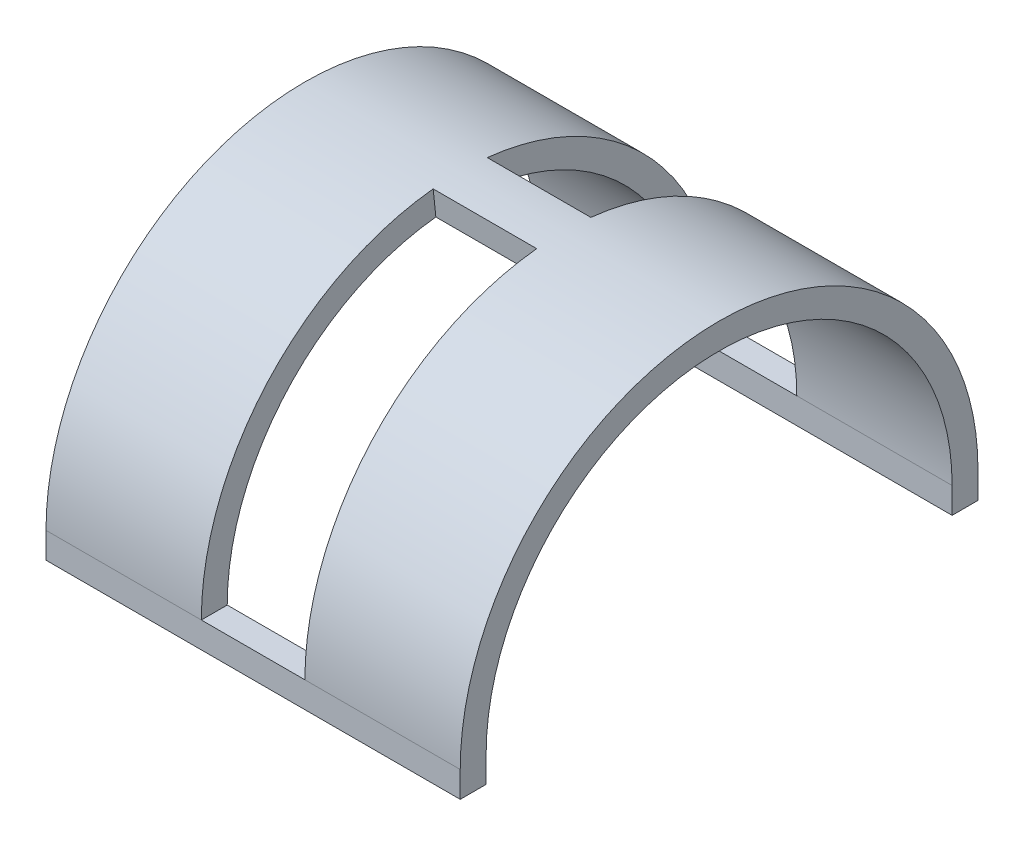
ISO-10303-21;
HEADER;
FILE_DESCRIPTION(('STEP AP214'),'2;1');
FILE_NAME('part.step','',(''),(''),'','','');
FILE_SCHEMA(('AUTOMOTIVE_DESIGN { 1 0 10303 214 1 1 1 1 }'));
ENDSEC;
DATA;
#1=APPLICATION_CONTEXT('core data for automotive mechanical design processes');
#2=APPLICATION_PROTOCOL_DEFINITION('international standard','automotive_design',2000,#1);
#3=PRODUCT_CONTEXT('',#1,'mechanical');
#4=PRODUCT('Part','Part','',(#3));
#5=PRODUCT_RELATED_PRODUCT_CATEGORY('part','',(#4));
#6=PRODUCT_DEFINITION_FORMATION('','',#4);
#7=PRODUCT_DEFINITION_CONTEXT('part definition',#1,'design');
#8=PRODUCT_DEFINITION('design','',#6,#7);
#9=PRODUCT_DEFINITION_SHAPE('','',#8);
#10=(LENGTH_UNIT() NAMED_UNIT(*) SI_UNIT(.MILLI.,.METRE.));
#11=(NAMED_UNIT(*) PLANE_ANGLE_UNIT() SI_UNIT($,.RADIAN.));
#12=(NAMED_UNIT(*) SI_UNIT($,.STERADIAN.) SOLID_ANGLE_UNIT());
#13=UNCERTAINTY_MEASURE_WITH_UNIT(LENGTH_MEASURE(1.E-05),#10,'distance_accuracy_value','');
#14=(GEOMETRIC_REPRESENTATION_CONTEXT(3) GLOBAL_UNCERTAINTY_ASSIGNED_CONTEXT((#13)) GLOBAL_UNIT_ASSIGNED_CONTEXT((#10,
#11,#12)) REPRESENTATION_CONTEXT('',''));
#15=CARTESIAN_POINT('',(0.,0.,0.));
#16=DIRECTION('',(0.,0.,1.));
#17=DIRECTION('',(1.,0.,0.));
#18=AXIS2_PLACEMENT_3D('',#15,#16,#17);
#19=CARTESIAN_POINT('',(30.,0.,0.));
#20=DIRECTION('',(-1.,0.,0.));
#21=DIRECTION('',(0.,0.,1.));
#22=AXIS2_PLACEMENT_3D('',#19,#20,#21);
#23=PLANE('',#22);
#24=DIRECTION('',(0.,0.994521895368274,-0.104528463267646));
#25=VECTOR('',#24,1.);
#26=CARTESIAN_POINT('',(30.,0.,0.));
#27=LINE('',#26,#25);
#28=CARTESIAN_POINT('',(30.,44.7534852915723,-4.70378084704408));
#29=VERTEX_POINT('',#28);
#30=CARTESIAN_POINT('',(30.,49.7260947684137,-5.22642316338232));
#31=VERTEX_POINT('',#30);
#32=EDGE_CURVE('E52',#29,#31,#27,.T.);
#33=ORIENTED_EDGE('',*,*,#32,.F.);
#34=CARTESIAN_POINT('',(30.,0.,0.));
#35=DIRECTION('',(-1.,0.,0.));
#36=DIRECTION('',(0.,0.,1.));
#37=AXIS2_PLACEMENT_3D('',#34,#35,#36);
#38=CIRCLE('',#37,45.);
#39=CARTESIAN_POINT('',(30.,0.,-45.));
#40=VERTEX_POINT('',#39);
#41=EDGE_CURVE('E259',#29,#40,#38,.T.);
#42=ORIENTED_EDGE('',*,*,#41,.T.);
#43=DIRECTION('',(0.,0.,-1.));
#44=VECTOR('',#43,1.);
#45=CARTESIAN_POINT('',(30.,0.,-45.));
#46=LINE('',#45,#44);
#47=CARTESIAN_POINT('',(30.,0.,-50.));
#48=VERTEX_POINT('',#47);
#49=EDGE_CURVE('E261',#40,#48,#46,.T.);
#50=ORIENTED_EDGE('',*,*,#49,.T.);
#51=CARTESIAN_POINT('',(30.,0.,0.));
#52=DIRECTION('',(1.,0.,0.));
#53=DIRECTION('',(0.,0.,1.));
#54=AXIS2_PLACEMENT_3D('',#51,#52,#53);
#55=CIRCLE('',#54,50.);
#56=EDGE_CURVE('E254',#48,#31,#55,.T.);
#57=ORIENTED_EDGE('',*,*,#56,.T.);
#58=EDGE_LOOP('',(#33,#42,#50,#57));
#59=FACE_BOUND('',#58,.T.);
#60=ADVANCED_FACE('F37',(#59),#23,.F.);
#61=CARTESIAN_POINT('',(30.,0.,0.));
#62=DIRECTION('',(-1.,0.,0.));
#63=DIRECTION('',(0.,0.,1.));
#64=AXIS2_PLACEMENT_3D('',#61,#62,#63);
#65=CYLINDRICAL_SURFACE('',#64,50.);
#66=CARTESIAN_POINT('',(0.,0.,0.));
#67=DIRECTION('',(1.,0.,0.));
#68=DIRECTION('',(0.,0.,1.));
#69=AXIS2_PLACEMENT_3D('',#66,#67,#68);
#70=CIRCLE('',#69,50.);
#71=CARTESIAN_POINT('',(0.,0.,-50.));
#72=VERTEX_POINT('',#71);
#73=CARTESIAN_POINT('',(0.,0.,50.));
#74=VERTEX_POINT('',#73);
#75=EDGE_CURVE('E253',#72,#74,#70,.T.);
#76=ORIENTED_EDGE('',*,*,#75,.T.);
#77=DIRECTION('',(-1.,0.,0.));
#78=VECTOR('',#77,1.);
#79=CARTESIAN_POINT('',(30.,0.,50.));
#80=LINE('',#79,#78);
#81=CARTESIAN_POINT('',(30.,0.,50.));
#82=VERTEX_POINT('',#81);
#83=EDGE_CURVE('E11',#82,#74,#80,.T.);
#84=ORIENTED_EDGE('',*,*,#83,.F.);
#85=CARTESIAN_POINT('',(30.,49.7260947684137,5.22642316338234));
#86=VERTEX_POINT('',#85);
#87=EDGE_CURVE('E257',#86,#82,#55,.T.);
#88=ORIENTED_EDGE('',*,*,#87,.F.);
#89=DIRECTION('',(-1.,0.,0.));
#90=VECTOR('',#89,1.);
#91=CARTESIAN_POINT('',(40.,49.7260947684137,5.22642316338234));
#92=LINE('',#91,#90);
#93=CARTESIAN_POINT('',(50.,49.7260947684137,5.22642316338234));
#94=VERTEX_POINT('',#93);
#95=EDGE_CURVE('E244',#94,#86,#92,.T.);
#96=ORIENTED_EDGE('',*,*,#95,.F.);
#97=CARTESIAN_POINT('',(50.,0.,0.));
#98=DIRECTION('',(1.,0.,0.));
#99=DIRECTION('',(0.,0.,1.));
#100=AXIS2_PLACEMENT_3D('',#97,#98,#99);
#101=CIRCLE('',#100,50.);
#102=CARTESIAN_POINT('',(50.,0.,50.));
#103=VERTEX_POINT('',#102);
#104=EDGE_CURVE('E218',#94,#103,#101,.T.);
#105=ORIENTED_EDGE('',*,*,#104,.T.);
#106=DIRECTION('',(1.,0.,0.));
#107=VECTOR('',#106,1.);
#108=CARTESIAN_POINT('',(50.,0.,50.));
#109=LINE('',#108,#107);
#110=CARTESIAN_POINT('',(80.,0.,50.));
#111=VERTEX_POINT('',#110);
#112=EDGE_CURVE('E236',#103,#111,#109,.T.);
#113=ORIENTED_EDGE('',*,*,#112,.T.);
#114=CARTESIAN_POINT('',(80.,0.,0.));
#115=DIRECTION('',(1.,0.,0.));
#116=DIRECTION('',(0.,0.,1.));
#117=AXIS2_PLACEMENT_3D('',#114,#115,#116);
#118=CIRCLE('',#117,50.);
#119=CARTESIAN_POINT('',(80.,0.,-50.));
#120=VERTEX_POINT('',#119);
#121=EDGE_CURVE('E213',#120,#111,#118,.T.);
#122=ORIENTED_EDGE('',*,*,#121,.F.);
#123=DIRECTION('',(1.,0.,0.));
#124=VECTOR('',#123,1.);
#125=CARTESIAN_POINT('',(50.,0.,-50.));
#126=LINE('',#125,#124);
#127=CARTESIAN_POINT('',(50.,0.,-50.));
#128=VERTEX_POINT('',#127);
#129=EDGE_CURVE('E226',#128,#120,#126,.T.);
#130=ORIENTED_EDGE('',*,*,#129,.F.);
#131=CARTESIAN_POINT('',(50.,49.7260947684137,-5.22642316338232));
#132=VERTEX_POINT('',#131);
#133=EDGE_CURVE('E214',#128,#132,#101,.T.);
#134=ORIENTED_EDGE('',*,*,#133,.T.);
#135=DIRECTION('',(-1.,0.,0.));
#136=VECTOR('',#135,1.);
#137=CARTESIAN_POINT('',(40.,49.7260947684137,-5.22642316338232));
#138=LINE('',#137,#136);
#139=EDGE_CURVE('E247',#132,#31,#138,.T.);
#140=ORIENTED_EDGE('',*,*,#139,.T.);
#141=ORIENTED_EDGE('',*,*,#56,.F.);
#142=DIRECTION('',(-1.,0.,0.));
#143=VECTOR('',#142,1.);
#144=CARTESIAN_POINT('',(30.,0.,-50.));
#145=LINE('',#144,#143);
#146=EDGE_CURVE('E263',#48,#72,#145,.T.);
#147=ORIENTED_EDGE('',*,*,#146,.T.);
#148=EDGE_LOOP('',(#76,#84,#88,#96,#105,#113,#122,#130,#134,#140,#141,#147));
#149=FACE_BOUND('',#148,.T.);
#150=ADVANCED_FACE('F39',(#149),#65,.T.);
#151=CARTESIAN_POINT('',(30.,0.,0.));
#152=DIRECTION('',(-1.,0.,0.));
#153=DIRECTION('',(0.,0.,1.));
#154=AXIS2_PLACEMENT_3D('',#151,#152,#153);
#155=CYLINDRICAL_SURFACE('',#154,45.);
#156=CARTESIAN_POINT('',(0.,0.,0.));
#157=DIRECTION('',(-1.,0.,0.));
#158=DIRECTION('',(0.,0.,1.));
#159=AXIS2_PLACEMENT_3D('',#156,#157,#158);
#160=CIRCLE('',#159,45.);
#161=CARTESIAN_POINT('',(0.,0.,45.));
#162=VERTEX_POINT('',#161);
#163=CARTESIAN_POINT('',(0.,0.,-45.));
#164=VERTEX_POINT('',#163);
#165=EDGE_CURVE('E265',#162,#164,#160,.T.);
#166=ORIENTED_EDGE('',*,*,#165,.T.);
#167=DIRECTION('',(-1.,0.,0.));
#168=VECTOR('',#167,1.);
#169=CARTESIAN_POINT('',(30.,0.,-45.));
#170=LINE('',#169,#168);
#171=EDGE_CURVE('E269',#40,#164,#170,.T.);
#172=ORIENTED_EDGE('',*,*,#171,.F.);
#173=ORIENTED_EDGE('',*,*,#41,.F.);
#174=DIRECTION('',(-1.,0.,0.));
#175=VECTOR('',#174,1.);
#176=CARTESIAN_POINT('',(40.,44.7534852915723,-4.70378084704408));
#177=LINE('',#176,#175);
#178=CARTESIAN_POINT('',(50.,44.7534852915723,-4.70378084704408));
#179=VERTEX_POINT('',#178);
#180=EDGE_CURVE('E250',#179,#29,#177,.T.);
#181=ORIENTED_EDGE('',*,*,#180,.F.);
#182=CARTESIAN_POINT('',(50.,0.,0.));
#183=DIRECTION('',(-1.,0.,0.));
#184=DIRECTION('',(0.,0.,1.));
#185=AXIS2_PLACEMENT_3D('',#182,#183,#184);
#186=CIRCLE('',#185,45.);
#187=CARTESIAN_POINT('',(50.,0.,-45.));
#188=VERTEX_POINT('',#187);
#189=EDGE_CURVE('E220',#179,#188,#186,.T.);
#190=ORIENTED_EDGE('',*,*,#189,.T.);
#191=DIRECTION('',(1.,0.,0.));
#192=VECTOR('',#191,1.);
#193=CARTESIAN_POINT('',(50.,0.,-45.));
#194=LINE('',#193,#192);
#195=CARTESIAN_POINT('',(80.,0.,-45.));
#196=VERTEX_POINT('',#195);
#197=EDGE_CURVE('E231',#188,#196,#194,.T.);
#198=ORIENTED_EDGE('',*,*,#197,.T.);
#199=CARTESIAN_POINT('',(80.,0.,0.));
#200=DIRECTION('',(-1.,0.,0.));
#201=DIRECTION('',(0.,0.,1.));
#202=AXIS2_PLACEMENT_3D('',#199,#200,#201);
#203=CIRCLE('',#202,45.);
#204=CARTESIAN_POINT('',(80.,0.,45.));
#205=VERTEX_POINT('',#204);
#206=EDGE_CURVE('E176',#205,#196,#203,.T.);
#207=ORIENTED_EDGE('',*,*,#206,.F.);
#208=DIRECTION('',(1.,0.,0.));
#209=VECTOR('',#208,1.);
#210=CARTESIAN_POINT('',(50.,0.,45.));
#211=LINE('',#210,#209);
#212=CARTESIAN_POINT('',(50.,0.,45.));
#213=VERTEX_POINT('',#212);
#214=EDGE_CURVE('E233',#213,#205,#211,.T.);
#215=ORIENTED_EDGE('',*,*,#214,.F.);
#216=CARTESIAN_POINT('',(50.,44.7534852915723,4.70378084704411));
#217=VERTEX_POINT('',#216);
#218=EDGE_CURVE('E221',#213,#217,#186,.T.);
#219=ORIENTED_EDGE('',*,*,#218,.T.);
#220=DIRECTION('',(-1.,0.,0.));
#221=VECTOR('',#220,1.);
#222=CARTESIAN_POINT('',(40.,44.7534852915723,4.70378084704411));
#223=LINE('',#222,#221);
#224=CARTESIAN_POINT('',(30.,44.7534852915723,4.70378084704411));
#225=VERTEX_POINT('',#224);
#226=EDGE_CURVE('E242',#217,#225,#223,.T.);
#227=ORIENTED_EDGE('',*,*,#226,.T.);
#228=CARTESIAN_POINT('',(30.,0.,45.));
#229=VERTEX_POINT('',#228);
#230=EDGE_CURVE('E60',#229,#225,#38,.T.);
#231=ORIENTED_EDGE('',*,*,#230,.F.);
#232=DIRECTION('',(-1.,0.,0.));
#233=VECTOR('',#232,1.);
#234=CARTESIAN_POINT('',(30.,0.,45.));
#235=LINE('',#234,#233);
#236=EDGE_CURVE('E45',#229,#162,#235,.T.);
#237=ORIENTED_EDGE('',*,*,#236,.T.);
#238=EDGE_LOOP('',(#166,#172,#173,#181,#190,#198,#207,#215,#219,#227,#231,#237));
#239=FACE_BOUND('',#238,.T.);
#240=ADVANCED_FACE('F273',(#239),#155,.F.);
#241=ORIENTED_EDGE('',*,*,#230,.T.);
#242=DIRECTION('',(0.,0.994521895368274,0.104528463267647));
#243=VECTOR('',#242,1.);
#244=CARTESIAN_POINT('',(30.,0.,0.));
#245=LINE('',#244,#243);
#246=EDGE_CURVE('E240',#225,#86,#245,.T.);
#247=ORIENTED_EDGE('',*,*,#246,.T.);
#248=ORIENTED_EDGE('',*,*,#87,.T.);
#249=DIRECTION('',(0.,0.,-1.));
#250=VECTOR('',#249,1.);
#251=CARTESIAN_POINT('',(30.,0.,50.));
#252=LINE('',#251,#250);
#253=EDGE_CURVE('E256',#82,#229,#252,.T.);
#254=ORIENTED_EDGE('',*,*,#253,.T.);
#255=EDGE_LOOP('',(#241,#247,#248,#254));
#256=FACE_BOUND('',#255,.T.);
#257=ADVANCED_FACE('F344',(#256),#23,.F.);
#258=CARTESIAN_POINT('',(0.,0.,0.));
#259=DIRECTION('',(-1.,0.,0.));
#260=DIRECTION('',(0.,0.,1.));
#261=AXIS2_PLACEMENT_3D('',#258,#259,#260);
#262=PLANE('',#261);
#263=ORIENTED_EDGE('',*,*,#75,.F.);
#264=DIRECTION('',(0.,1.,0.));
#265=VECTOR('',#264,1.);
#266=CARTESIAN_POINT('',(0.,-5.,-50.));
#267=LINE('',#266,#265);
#268=CARTESIAN_POINT('',(0.,-5.,-50.));
#269=VERTEX_POINT('',#268);
#270=EDGE_CURVE('E182',#269,#72,#267,.T.);
#271=ORIENTED_EDGE('',*,*,#270,.F.);
#272=DIRECTION('',(0.,0.,-1.));
#273=VECTOR('',#272,1.);
#274=CARTESIAN_POINT('',(0.,-5.,-50.));
#275=LINE('',#274,#273);
#276=CARTESIAN_POINT('',(0.,-5.,-45.));
#277=VERTEX_POINT('',#276);
#278=EDGE_CURVE('E161',#277,#269,#275,.T.);
#279=ORIENTED_EDGE('',*,*,#278,.F.);
#280=DIRECTION('',(0.,1.,0.));
#281=VECTOR('',#280,1.);
#282=CARTESIAN_POINT('',(0.,-5.,-45.));
#283=LINE('',#282,#281);
#284=EDGE_CURVE('E158',#277,#164,#283,.T.);
#285=ORIENTED_EDGE('',*,*,#284,.T.);
#286=ORIENTED_EDGE('',*,*,#165,.F.);
#287=DIRECTION('',(0.,1.,0.));
#288=VECTOR('',#287,1.);
#289=CARTESIAN_POINT('',(0.,-5.,45.));
#290=LINE('',#289,#288);
#291=CARTESIAN_POINT('',(0.,-5.,45.));
#292=VERTEX_POINT('',#291);
#293=EDGE_CURVE('E204',#292,#162,#290,.T.);
#294=ORIENTED_EDGE('',*,*,#293,.F.);
#295=DIRECTION('',(0.,0.,-1.));
#296=VECTOR('',#295,1.);
#297=CARTESIAN_POINT('',(0.,-5.,50.));
#298=LINE('',#297,#296);
#299=CARTESIAN_POINT('',(0.,-5.,50.));
#300=VERTEX_POINT('',#299);
#301=EDGE_CURVE('E186',#300,#292,#298,.T.);
#302=ORIENTED_EDGE('',*,*,#301,.F.);
#303=DIRECTION('',(0.,1.,0.));
#304=VECTOR('',#303,1.);
#305=CARTESIAN_POINT('',(0.,-5.,50.));
#306=LINE('',#305,#304);
#307=EDGE_CURVE('E194',#300,#74,#306,.T.);
#308=ORIENTED_EDGE('',*,*,#307,.T.);
#309=EDGE_LOOP('',(#263,#271,#279,#285,#286,#294,#302,#308));
#310=FACE_BOUND('',#309,.T.);
#311=ADVANCED_FACE('F282',(#310),#262,.T.);
#312=CARTESIAN_POINT('',(40.,0.,0.));
#313=DIRECTION('',(0.,0.104528463267646,0.994521895368274));
#314=DIRECTION('',(0.,-0.994521895368274,0.104528463267646));
#315=AXIS2_PLACEMENT_3D('',#312,#313,#314);
#316=PLANE('',#315);
#317=ORIENTED_EDGE('',*,*,#32,.T.);
#318=ORIENTED_EDGE('',*,*,#139,.F.);
#319=DIRECTION('',(0.,0.994521895368274,-0.104528463267646));
#320=VECTOR('',#319,1.);
#321=CARTESIAN_POINT('',(50.,0.,0.));
#322=LINE('',#321,#320);
#323=EDGE_CURVE('E207',#179,#132,#322,.T.);
#324=ORIENTED_EDGE('',*,*,#323,.F.);
#325=ORIENTED_EDGE('',*,*,#180,.T.);
#326=EDGE_LOOP('',(#317,#318,#324,#325));
#327=FACE_BOUND('',#326,.T.);
#328=ADVANCED_FACE('F328',(#327),#316,.F.);
#329=CARTESIAN_POINT('',(40.,0.,0.));
#330=DIRECTION('',(0.,-0.104528463267647,0.994521895368274));
#331=DIRECTION('',(0.,-0.994521895368274,-0.104528463267647));
#332=AXIS2_PLACEMENT_3D('',#329,#330,#331);
#333=PLANE('',#332);
#334=ORIENTED_EDGE('',*,*,#246,.F.);
#335=ORIENTED_EDGE('',*,*,#226,.F.);
#336=DIRECTION('',(0.,0.994521895368274,0.104528463267647));
#337=VECTOR('',#336,1.);
#338=CARTESIAN_POINT('',(50.,0.,0.));
#339=LINE('',#338,#337);
#340=EDGE_CURVE('E210',#217,#94,#339,.T.);
#341=ORIENTED_EDGE('',*,*,#340,.T.);
#342=ORIENTED_EDGE('',*,*,#95,.T.);
#343=EDGE_LOOP('',(#334,#335,#341,#342));
#344=FACE_BOUND('',#343,.T.);
#345=ADVANCED_FACE('F332',(#344),#333,.T.);
#346=CARTESIAN_POINT('',(50.,0.,0.));
#347=DIRECTION('',(1.,0.,0.));
#348=DIRECTION('',(0.,0.,1.));
#349=AXIS2_PLACEMENT_3D('',#346,#347,#348);
#350=PLANE('',#349);
#351=ORIENTED_EDGE('',*,*,#323,.T.);
#352=ORIENTED_EDGE('',*,*,#133,.F.);
#353=DIRECTION('',(0.,0.,-1.));
#354=VECTOR('',#353,1.);
#355=CARTESIAN_POINT('',(50.,0.,-45.));
#356=LINE('',#355,#354);
#357=EDGE_CURVE('E224',#188,#128,#356,.T.);
#358=ORIENTED_EDGE('',*,*,#357,.F.);
#359=ORIENTED_EDGE('',*,*,#189,.F.);
#360=EDGE_LOOP('',(#351,#352,#358,#359));
#361=FACE_BOUND('',#360,.T.);
#362=ADVANCED_FACE('F330',(#361),#350,.F.);
#363=ORIENTED_EDGE('',*,*,#218,.F.);
#364=DIRECTION('',(0.,0.,-1.));
#365=VECTOR('',#364,1.);
#366=CARTESIAN_POINT('',(50.,0.,50.));
#367=LINE('',#366,#365);
#368=EDGE_CURVE('E217',#103,#213,#367,.T.);
#369=ORIENTED_EDGE('',*,*,#368,.F.);
#370=ORIENTED_EDGE('',*,*,#104,.F.);
#371=ORIENTED_EDGE('',*,*,#340,.F.);
#372=EDGE_LOOP('',(#363,#369,#370,#371));
#373=FACE_BOUND('',#372,.T.);
#374=ADVANCED_FACE('F312',(#373),#350,.F.);
#375=CARTESIAN_POINT('',(80.,0.,0.));
#376=DIRECTION('',(1.,0.,0.));
#377=DIRECTION('',(0.,0.,1.));
#378=AXIS2_PLACEMENT_3D('',#375,#376,#377);
#379=PLANE('',#378);
#380=ORIENTED_EDGE('',*,*,#121,.T.);
#381=DIRECTION('',(0.,1.,0.));
#382=VECTOR('',#381,1.);
#383=CARTESIAN_POINT('',(80.,-5.,50.));
#384=LINE('',#383,#382);
#385=CARTESIAN_POINT('',(80.,-5.,50.));
#386=VERTEX_POINT('',#385);
#387=EDGE_CURVE('E200',#386,#111,#384,.T.);
#388=ORIENTED_EDGE('',*,*,#387,.F.);
#389=DIRECTION('',(0.,0.,1.));
#390=VECTOR('',#389,1.);
#391=CARTESIAN_POINT('',(80.,-5.,50.));
#392=LINE('',#391,#390);
#393=CARTESIAN_POINT('',(80.,-5.,45.));
#394=VERTEX_POINT('',#393);
#395=EDGE_CURVE('E191',#394,#386,#392,.T.);
#396=ORIENTED_EDGE('',*,*,#395,.F.);
#397=DIRECTION('',(0.,1.,0.));
#398=VECTOR('',#397,1.);
#399=CARTESIAN_POINT('',(80.,-5.,45.));
#400=LINE('',#399,#398);
#401=EDGE_CURVE('E202',#394,#205,#400,.T.);
#402=ORIENTED_EDGE('',*,*,#401,.T.);
#403=ORIENTED_EDGE('',*,*,#206,.T.);
#404=DIRECTION('',(0.,1.,0.));
#405=VECTOR('',#404,1.);
#406=CARTESIAN_POINT('',(80.,-5.,-45.));
#407=LINE('',#406,#405);
#408=CARTESIAN_POINT('',(80.,-5.,-45.));
#409=VERTEX_POINT('',#408);
#410=EDGE_CURVE('E154',#409,#196,#407,.T.);
#411=ORIENTED_EDGE('',*,*,#410,.F.);
#412=DIRECTION('',(0.,0.,1.));
#413=VECTOR('',#412,1.);
#414=CARTESIAN_POINT('',(80.,-5.,-50.));
#415=LINE('',#414,#413);
#416=CARTESIAN_POINT('',(80.,-5.,-50.));
#417=VERTEX_POINT('',#416);
#418=EDGE_CURVE('E162',#417,#409,#415,.T.);
#419=ORIENTED_EDGE('',*,*,#418,.F.);
#420=DIRECTION('',(0.,1.,0.));
#421=VECTOR('',#420,1.);
#422=CARTESIAN_POINT('',(80.,-5.,-50.));
#423=LINE('',#422,#421);
#424=EDGE_CURVE('E286',#417,#120,#423,.T.);
#425=ORIENTED_EDGE('',*,*,#424,.T.);
#426=EDGE_LOOP('',(#380,#388,#396,#402,#403,#411,#419,#425));
#427=FACE_BOUND('',#426,.T.);
#428=ADVANCED_FACE('F174',(#427),#379,.T.);
#429=CARTESIAN_POINT('',(0.,0.,0.));
#430=DIRECTION('',(0.,-1.,0.));
#431=DIRECTION('',(0.,0.,-1.));
#432=AXIS2_PLACEMENT_3D('',#429,#430,#431);
#433=PLANE('',#432);
#434=DIRECTION('',(1.,0.,0.));
#435=VECTOR('',#434,1.);
#436=CARTESIAN_POINT('',(0.,0.,45.));
#437=LINE('',#436,#435);
#438=EDGE_CURVE('E177',#229,#213,#437,.T.);
#439=ORIENTED_EDGE('',*,*,#438,.F.);
#440=ORIENTED_EDGE('',*,*,#253,.F.);
#441=DIRECTION('',(-1.,0.,0.));
#442=VECTOR('',#441,1.);
#443=CARTESIAN_POINT('',(0.,0.,50.));
#444=LINE('',#443,#442);
#445=EDGE_CURVE('E180',#103,#82,#444,.T.);
#446=ORIENTED_EDGE('',*,*,#445,.F.);
#447=ORIENTED_EDGE('',*,*,#368,.T.);
#448=EDGE_LOOP('',(#439,#440,#446,#447));
#449=FACE_BOUND('',#448,.T.);
#450=ADVANCED_FACE('F316',(#449),#433,.F.);
#451=CARTESIAN_POINT('',(0.,-5.,45.));
#452=DIRECTION('',(0.,0.,1.));
#453=DIRECTION('',(1.,0.,0.));
#454=AXIS2_PLACEMENT_3D('',#451,#452,#453);
#455=PLANE('',#454);
#456=ORIENTED_EDGE('',*,*,#236,.F.);
#457=ORIENTED_EDGE('',*,*,#438,.T.);
#458=ORIENTED_EDGE('',*,*,#214,.T.);
#459=ORIENTED_EDGE('',*,*,#401,.F.);
#460=DIRECTION('',(1.,0.,0.));
#461=VECTOR('',#460,1.);
#462=CARTESIAN_POINT('',(0.,-5.,45.));
#463=LINE('',#462,#461);
#464=EDGE_CURVE('E189',#292,#394,#463,.T.);
#465=ORIENTED_EDGE('',*,*,#464,.F.);
#466=ORIENTED_EDGE('',*,*,#293,.T.);
#467=EDGE_LOOP('',(#456,#457,#458,#459,#465,#466));
#468=FACE_BOUND('',#467,.T.);
#469=ADVANCED_FACE('F278',(#468),#455,.F.);
#470=CARTESIAN_POINT('',(0.,-5.,50.));
#471=DIRECTION('',(0.,0.,-1.));
#472=DIRECTION('',(-1.,0.,0.));
#473=AXIS2_PLACEMENT_3D('',#470,#471,#472);
#474=PLANE('',#473);
#475=ORIENTED_EDGE('',*,*,#112,.F.);
#476=ORIENTED_EDGE('',*,*,#445,.T.);
#477=ORIENTED_EDGE('',*,*,#83,.T.);
#478=ORIENTED_EDGE('',*,*,#307,.F.);
#479=DIRECTION('',(-1.,0.,0.));
#480=VECTOR('',#479,1.);
#481=CARTESIAN_POINT('',(0.,-5.,50.));
#482=LINE('',#481,#480);
#483=EDGE_CURVE('E193',#386,#300,#482,.T.);
#484=ORIENTED_EDGE('',*,*,#483,.F.);
#485=ORIENTED_EDGE('',*,*,#387,.T.);
#486=EDGE_LOOP('',(#475,#476,#477,#478,#484,#485));
#487=FACE_BOUND('',#486,.T.);
#488=ADVANCED_FACE('F309',(#487),#474,.F.);
#489=CARTESIAN_POINT('',(0.,-5.,0.));
#490=DIRECTION('',(0.,-1.,0.));
#491=DIRECTION('',(0.,0.,-1.));
#492=AXIS2_PLACEMENT_3D('',#489,#490,#491);
#493=PLANE('',#492);
#494=ORIENTED_EDGE('',*,*,#301,.T.);
#495=ORIENTED_EDGE('',*,*,#464,.T.);
#496=ORIENTED_EDGE('',*,*,#395,.T.);
#497=ORIENTED_EDGE('',*,*,#483,.T.);
#498=EDGE_LOOP('',(#494,#495,#496,#497));
#499=FACE_BOUND('',#498,.T.);
#500=ADVANCED_FACE('F435',(#499),#493,.T.);
#501=CARTESIAN_POINT('',(0.,0.,0.));
#502=DIRECTION('',(0.,-1.,0.));
#503=DIRECTION('',(0.,0.,-1.));
#504=AXIS2_PLACEMENT_3D('',#501,#502,#503);
#505=PLANE('',#504);
#506=DIRECTION('',(1.,0.,0.));
#507=VECTOR('',#506,1.);
#508=CARTESIAN_POINT('',(80.,0.,-50.));
#509=LINE('',#508,#507);
#510=EDGE_CURVE('E170',#48,#128,#509,.T.);
#511=ORIENTED_EDGE('',*,*,#510,.F.);
#512=ORIENTED_EDGE('',*,*,#49,.F.);
#513=DIRECTION('',(-1.,0.,0.));
#514=VECTOR('',#513,1.);
#515=CARTESIAN_POINT('',(80.,0.,-45.));
#516=LINE('',#515,#514);
#517=EDGE_CURVE('E289',#188,#40,#516,.T.);
#518=ORIENTED_EDGE('',*,*,#517,.F.);
#519=ORIENTED_EDGE('',*,*,#357,.T.);
#520=EDGE_LOOP('',(#511,#512,#518,#519));
#521=FACE_BOUND('',#520,.T.);
#522=ADVANCED_FACE('F324',(#521),#505,.F.);
#523=CARTESIAN_POINT('',(80.,-5.,-45.));
#524=DIRECTION('',(0.,0.,-1.));
#525=DIRECTION('',(-1.,0.,0.));
#526=AXIS2_PLACEMENT_3D('',#523,#524,#525);
#527=PLANE('',#526);
#528=ORIENTED_EDGE('',*,*,#197,.F.);
#529=ORIENTED_EDGE('',*,*,#517,.T.);
#530=ORIENTED_EDGE('',*,*,#171,.T.);
#531=ORIENTED_EDGE('',*,*,#284,.F.);
#532=DIRECTION('',(-1.,0.,0.));
#533=VECTOR('',#532,1.);
#534=CARTESIAN_POINT('',(80.,-5.,-45.));
#535=LINE('',#534,#533);
#536=EDGE_CURVE('E149',#409,#277,#535,.T.);
#537=ORIENTED_EDGE('',*,*,#536,.F.);
#538=ORIENTED_EDGE('',*,*,#410,.T.);
#539=EDGE_LOOP('',(#528,#529,#530,#531,#537,#538));
#540=FACE_BOUND('',#539,.T.);
#541=ADVANCED_FACE('F152',(#540),#527,.F.);
#542=CARTESIAN_POINT('',(80.,-5.,-50.));
#543=DIRECTION('',(0.,0.,1.));
#544=DIRECTION('',(1.,0.,0.));
#545=AXIS2_PLACEMENT_3D('',#542,#543,#544);
#546=PLANE('',#545);
#547=ORIENTED_EDGE('',*,*,#146,.F.);
#548=ORIENTED_EDGE('',*,*,#510,.T.);
#549=ORIENTED_EDGE('',*,*,#129,.T.);
#550=ORIENTED_EDGE('',*,*,#424,.F.);
#551=DIRECTION('',(1.,0.,0.));
#552=VECTOR('',#551,1.);
#553=CARTESIAN_POINT('',(80.,-5.,-50.));
#554=LINE('',#553,#552);
#555=EDGE_CURVE('E167',#269,#417,#554,.T.);
#556=ORIENTED_EDGE('',*,*,#555,.F.);
#557=ORIENTED_EDGE('',*,*,#270,.T.);
#558=EDGE_LOOP('',(#547,#548,#549,#550,#556,#557));
#559=FACE_BOUND('',#558,.T.);
#560=ADVANCED_FACE('F296',(#559),#546,.F.);
#561=CARTESIAN_POINT('',(0.,-5.,0.));
#562=DIRECTION('',(0.,-1.,0.));
#563=DIRECTION('',(0.,0.,-1.));
#564=AXIS2_PLACEMENT_3D('',#561,#562,#563);
#565=PLANE('',#564);
#566=ORIENTED_EDGE('',*,*,#418,.T.);
#567=ORIENTED_EDGE('',*,*,#536,.T.);
#568=ORIENTED_EDGE('',*,*,#278,.T.);
#569=ORIENTED_EDGE('',*,*,#555,.T.);
#570=EDGE_LOOP('',(#566,#567,#568,#569));
#571=FACE_BOUND('',#570,.T.);
#572=ADVANCED_FACE('F165',(#571),#565,.T.);
#573=CLOSED_SHELL('',(#60,#150,#240,#257,#311,#328,#345,#362,#374,#428,#450,#469,#488,#500,#522,
#541,#560,#572));
#574=MANIFOLD_SOLID_BREP('B2',#573);
#575=ADVANCED_BREP_SHAPE_REPRESENTATION('',(#18,#574),#14);
#576=SHAPE_DEFINITION_REPRESENTATION(#9,#575);
ENDSEC;
END-ISO-10303-21;
